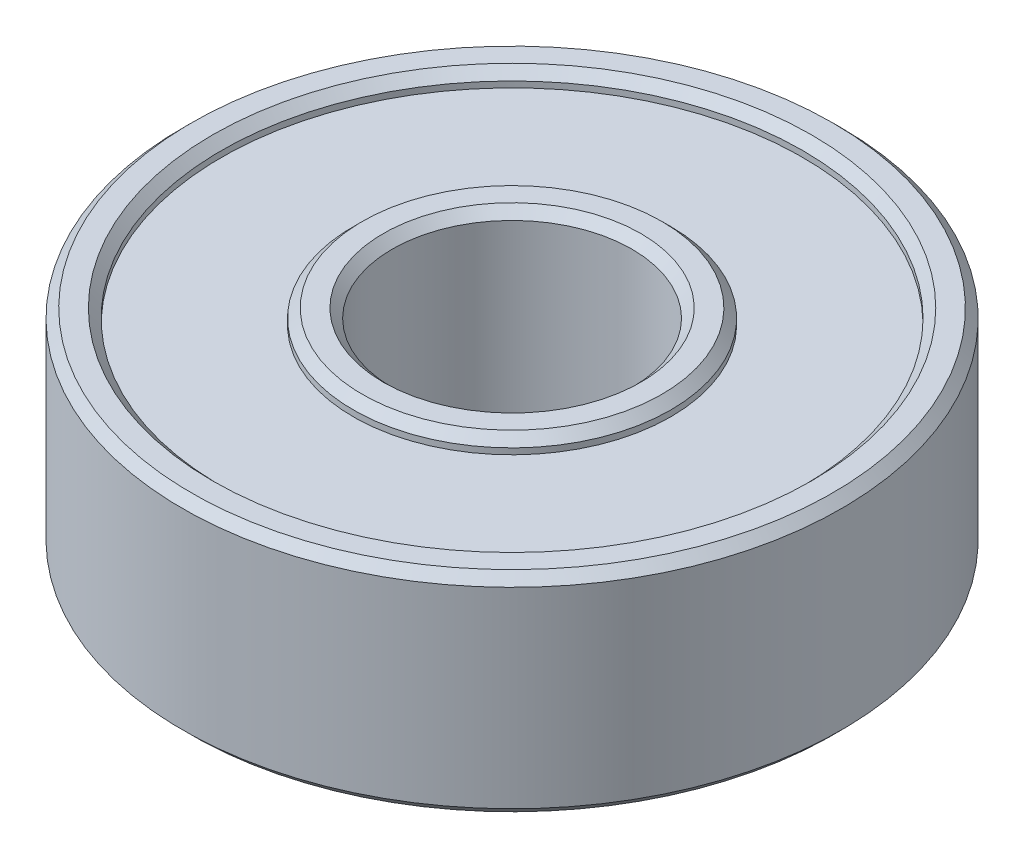
ISO-10303-21;
HEADER;
FILE_DESCRIPTION(('STEP AP214'),'2;1');
FILE_NAME('part.step','',(''),(''),'','','');
FILE_SCHEMA(('AUTOMOTIVE_DESIGN { 1 0 10303 214 1 1 1 1 }'));
ENDSEC;
DATA;
#1=APPLICATION_CONTEXT('core data for automotive mechanical design processes');
#2=APPLICATION_PROTOCOL_DEFINITION('international standard','automotive_design',2000,#1);
#3=PRODUCT_CONTEXT('',#1,'mechanical');
#4=PRODUCT('Part','Part','',(#3));
#5=PRODUCT_RELATED_PRODUCT_CATEGORY('part','',(#4));
#6=PRODUCT_DEFINITION_FORMATION('','',#4);
#7=PRODUCT_DEFINITION_CONTEXT('part definition',#1,'design');
#8=PRODUCT_DEFINITION('design','',#6,#7);
#9=PRODUCT_DEFINITION_SHAPE('','',#8);
#10=(LENGTH_UNIT() NAMED_UNIT(*) SI_UNIT(.MILLI.,.METRE.));
#11=(NAMED_UNIT(*) PLANE_ANGLE_UNIT() SI_UNIT($,.RADIAN.));
#12=(NAMED_UNIT(*) SI_UNIT($,.STERADIAN.) SOLID_ANGLE_UNIT());
#13=UNCERTAINTY_MEASURE_WITH_UNIT(LENGTH_MEASURE(1.E-05),#10,'distance_accuracy_value','');
#14=(GEOMETRIC_REPRESENTATION_CONTEXT(3) GLOBAL_UNCERTAINTY_ASSIGNED_CONTEXT((#13)) GLOBAL_UNIT_ASSIGNED_CONTEXT((#10,
#11,#12)) REPRESENTATION_CONTEXT('',''));
#15=CARTESIAN_POINT('',(0.,0.,0.));
#16=DIRECTION('',(0.,0.,1.));
#17=DIRECTION('',(1.,0.,0.));
#18=AXIS2_PLACEMENT_3D('',#15,#16,#17);
#19=CARTESIAN_POINT('',(0.,-3.5,0.));
#20=DIRECTION('',(0.,1.,0.));
#21=DIRECTION('',(0.,0.,1.));
#22=AXIS2_PLACEMENT_3D('',#19,#20,#21);
#23=CYLINDRICAL_SURFACE('',#22,9.7);
#24=CARTESIAN_POINT('',(0.,3.2,0.));
#25=DIRECTION('',(0.,-1.,0.));
#26=DIRECTION('',(0.,0.,-1.));
#27=AXIS2_PLACEMENT_3D('',#24,#25,#26);
#28=CIRCLE('',#27,9.7);
#29=CARTESIAN_POINT('',(0.,3.2,-9.7));
#30=VERTEX_POINT('',#29);
#31=EDGE_CURVE('E59',#30,#30,#28,.F.);
#32=ORIENTED_EDGE('',*,*,#31,.T.);
#33=EDGE_LOOP('',(#32));
#34=FACE_BOUND('',#33,.T.);
#35=CARTESIAN_POINT('',(0.,3.,0.));
#36=DIRECTION('',(0.,-1.,0.));
#37=DIRECTION('',(1.,0.,0.));
#38=AXIS2_PLACEMENT_3D('',#35,#36,#37);
#39=CIRCLE('',#38,9.7);
#40=CARTESIAN_POINT('',(9.7,3.,0.));
#41=VERTEX_POINT('',#40);
#42=EDGE_CURVE('E90',#41,#41,#39,.T.);
#43=ORIENTED_EDGE('',*,*,#42,.T.);
#44=EDGE_LOOP('',(#43));
#45=FACE_BOUND('',#44,.T.);
#46=ADVANCED_FACE('F14',(#34,#45),#23,.F.);
#47=CARTESIAN_POINT('',(0.,-3.2,0.));
#48=DIRECTION('',(0.,-1.,0.));
#49=DIRECTION('',(0.,0.,-1.));
#50=AXIS2_PLACEMENT_3D('',#47,#48,#49);
#51=CIRCLE('',#50,9.7);
#52=CARTESIAN_POINT('',(0.,-3.2,-9.7));
#53=VERTEX_POINT('',#52);
#54=EDGE_CURVE('E31',#53,#53,#51,.T.);
#55=ORIENTED_EDGE('',*,*,#54,.T.);
#56=EDGE_LOOP('',(#55));
#57=FACE_BOUND('',#56,.T.);
#58=CARTESIAN_POINT('',(0.,-3.,0.));
#59=DIRECTION('',(0.,-1.,0.));
#60=DIRECTION('',(1.,0.,0.));
#61=AXIS2_PLACEMENT_3D('',#58,#59,#60);
#62=CIRCLE('',#61,9.7);
#63=CARTESIAN_POINT('',(9.7,-3.,0.));
#64=VERTEX_POINT('',#63);
#65=EDGE_CURVE('E89',#64,#64,#62,.T.);
#66=ORIENTED_EDGE('',*,*,#65,.F.);
#67=EDGE_LOOP('',(#66));
#68=FACE_BOUND('',#67,.T.);
#69=ADVANCED_FACE('F117',(#57,#68),#23,.F.);
#70=CARTESIAN_POINT('',(0.,-3.5,0.));
#71=DIRECTION('',(0.,1.,0.));
#72=DIRECTION('',(0.,0.,1.));
#73=AXIS2_PLACEMENT_3D('',#70,#71,#72);
#74=CYLINDRICAL_SURFACE('',#73,11.);
#75=CARTESIAN_POINT('',(0.,3.2,0.));
#76=DIRECTION('',(0.,-1.,0.));
#77=DIRECTION('',(0.,0.,-1.));
#78=AXIS2_PLACEMENT_3D('',#75,#76,#77);
#79=CIRCLE('',#78,11.);
#80=CARTESIAN_POINT('',(0.,3.2,-11.));
#81=VERTEX_POINT('',#80);
#82=EDGE_CURVE('E52',#81,#81,#79,.T.);
#83=ORIENTED_EDGE('',*,*,#82,.T.);
#84=EDGE_LOOP('',(#83));
#85=FACE_BOUND('',#84,.T.);
#86=CARTESIAN_POINT('',(0.,-3.2,0.));
#87=DIRECTION('',(0.,-1.,0.));
#88=DIRECTION('',(0.,0.,-1.));
#89=AXIS2_PLACEMENT_3D('',#86,#87,#88);
#90=CIRCLE('',#89,11.);
#91=CARTESIAN_POINT('',(0.,-3.2,-11.));
#92=VERTEX_POINT('',#91);
#93=EDGE_CURVE('E56',#92,#92,#90,.F.);
#94=ORIENTED_EDGE('',*,*,#93,.T.);
#95=EDGE_LOOP('',(#94));
#96=FACE_BOUND('',#95,.T.);
#97=ADVANCED_FACE('F119',(#85,#96),#74,.T.);
#98=CARTESIAN_POINT('',(0.,-3.5,0.));
#99=DIRECTION('',(0.,-1.,0.));
#100=DIRECTION('',(1.,0.,0.));
#101=AXIS2_PLACEMENT_3D('',#98,#99,#100);
#102=PLANE('',#101);
#103=CARTESIAN_POINT('',(0.,-3.5,0.));
#104=DIRECTION('',(0.,-1.,0.));
#105=DIRECTION('',(0.,0.,-1.));
#106=AXIS2_PLACEMENT_3D('',#103,#104,#105);
#107=CIRCLE('',#106,10.);
#108=CARTESIAN_POINT('',(0.,-3.5,-10.));
#109=VERTEX_POINT('',#108);
#110=EDGE_CURVE('E9',#109,#109,#107,.F.);
#111=ORIENTED_EDGE('',*,*,#110,.T.);
#112=EDGE_LOOP('',(#111));
#113=FACE_BOUND('',#112,.T.);
#114=CARTESIAN_POINT('',(0.,-3.5,0.));
#115=DIRECTION('',(0.,-1.,0.));
#116=DIRECTION('',(0.,0.,-1.));
#117=AXIS2_PLACEMENT_3D('',#114,#115,#116);
#118=CIRCLE('',#117,10.7);
#119=CARTESIAN_POINT('',(0.,-3.5,-10.7));
#120=VERTEX_POINT('',#119);
#121=EDGE_CURVE('E22',#120,#120,#118,.T.);
#122=ORIENTED_EDGE('',*,*,#121,.T.);
#123=EDGE_LOOP('',(#122));
#124=FACE_BOUND('',#123,.T.);
#125=ADVANCED_FACE('F127',(#113,#124),#102,.T.);
#126=CARTESIAN_POINT('',(0.,3.5,0.));
#127=DIRECTION('',(0.,-1.,0.));
#128=DIRECTION('',(1.,0.,0.));
#129=AXIS2_PLACEMENT_3D('',#126,#127,#128);
#130=PLANE('',#129);
#131=CARTESIAN_POINT('',(0.,3.5,0.));
#132=DIRECTION('',(0.,-1.,0.));
#133=DIRECTION('',(0.,0.,-1.));
#134=AXIS2_PLACEMENT_3D('',#131,#132,#133);
#135=CIRCLE('',#134,10.);
#136=CARTESIAN_POINT('',(0.,3.5,-10.));
#137=VERTEX_POINT('',#136);
#138=EDGE_CURVE('E62',#137,#137,#135,.T.);
#139=ORIENTED_EDGE('',*,*,#138,.T.);
#140=EDGE_LOOP('',(#139));
#141=FACE_BOUND('',#140,.T.);
#142=CARTESIAN_POINT('',(0.,3.5,0.));
#143=DIRECTION('',(0.,-1.,0.));
#144=DIRECTION('',(0.,0.,-1.));
#145=AXIS2_PLACEMENT_3D('',#142,#143,#144);
#146=CIRCLE('',#145,10.7);
#147=CARTESIAN_POINT('',(0.,3.5,-10.7));
#148=VERTEX_POINT('',#147);
#149=EDGE_CURVE('E65',#148,#148,#146,.F.);
#150=ORIENTED_EDGE('',*,*,#149,.T.);
#151=EDGE_LOOP('',(#150));
#152=FACE_BOUND('',#151,.T.);
#153=ADVANCED_FACE('F132',(#141,#152),#130,.F.);
#154=CARTESIAN_POINT('',(0.,-3.5,0.));
#155=DIRECTION('',(0.,1.,0.));
#156=DIRECTION('',(0.,0.,1.));
#157=AXIS2_PLACEMENT_3D('',#154,#155,#156);
#158=CYLINDRICAL_SURFACE('',#157,5.3);
#159=CARTESIAN_POINT('',(0.,3.2,0.));
#160=DIRECTION('',(0.,-1.,0.));
#161=DIRECTION('',(0.,0.,-1.));
#162=AXIS2_PLACEMENT_3D('',#159,#160,#161);
#163=CIRCLE('',#162,5.3);
#164=CARTESIAN_POINT('',(0.,3.2,-5.3));
#165=VERTEX_POINT('',#164);
#166=EDGE_CURVE('E69',#165,#165,#163,.T.);
#167=ORIENTED_EDGE('',*,*,#166,.T.);
#168=EDGE_LOOP('',(#167));
#169=FACE_BOUND('',#168,.T.);
#170=CARTESIAN_POINT('',(0.,3.,0.));
#171=DIRECTION('',(0.,-1.,0.));
#172=DIRECTION('',(1.,0.,0.));
#173=AXIS2_PLACEMENT_3D('',#170,#171,#172);
#174=CIRCLE('',#173,5.3);
#175=CARTESIAN_POINT('',(5.3,3.,0.));
#176=VERTEX_POINT('',#175);
#177=EDGE_CURVE('E95',#176,#176,#174,.T.);
#178=ORIENTED_EDGE('',*,*,#177,.F.);
#179=EDGE_LOOP('',(#178));
#180=FACE_BOUND('',#179,.T.);
#181=ADVANCED_FACE('F203',(#169,#180),#158,.T.);
#182=CARTESIAN_POINT('',(0.,-3.5,0.));
#183=DIRECTION('',(0.,1.,0.));
#184=DIRECTION('',(0.,0.,1.));
#185=AXIS2_PLACEMENT_3D('',#182,#183,#184);
#186=CYLINDRICAL_SURFACE('',#185,4.);
#187=CARTESIAN_POINT('',(0.,3.2,0.));
#188=DIRECTION('',(0.,-1.,0.));
#189=DIRECTION('',(0.,0.,-1.));
#190=AXIS2_PLACEMENT_3D('',#187,#188,#189);
#191=CIRCLE('',#190,4.);
#192=CARTESIAN_POINT('',(0.,3.2,-4.));
#193=VERTEX_POINT('',#192);
#194=EDGE_CURVE('E73',#193,#193,#191,.F.);
#195=ORIENTED_EDGE('',*,*,#194,.T.);
#196=EDGE_LOOP('',(#195));
#197=FACE_BOUND('',#196,.T.);
#198=CARTESIAN_POINT('',(0.,-3.2,0.));
#199=DIRECTION('',(0.,-1.,0.));
#200=DIRECTION('',(0.,0.,-1.));
#201=AXIS2_PLACEMENT_3D('',#198,#199,#200);
#202=CIRCLE('',#201,4.);
#203=CARTESIAN_POINT('',(0.,-3.2,-4.));
#204=VERTEX_POINT('',#203);
#205=EDGE_CURVE('E77',#204,#204,#202,.T.);
#206=ORIENTED_EDGE('',*,*,#205,.T.);
#207=EDGE_LOOP('',(#206));
#208=FACE_BOUND('',#207,.T.);
#209=ADVANCED_FACE('F224',(#197,#208),#186,.F.);
#210=CARTESIAN_POINT('',(0.,-3.2,0.));
#211=DIRECTION('',(0.,-1.,0.));
#212=DIRECTION('',(0.,0.,-1.));
#213=AXIS2_PLACEMENT_3D('',#210,#211,#212);
#214=CIRCLE('',#213,5.3);
#215=CARTESIAN_POINT('',(0.,-3.2,-5.3));
#216=VERTEX_POINT('',#215);
#217=EDGE_CURVE('E38',#216,#216,#214,.F.);
#218=ORIENTED_EDGE('',*,*,#217,.T.);
#219=EDGE_LOOP('',(#218));
#220=FACE_BOUND('',#219,.T.);
#221=CARTESIAN_POINT('',(0.,-3.,0.));
#222=DIRECTION('',(0.,-1.,0.));
#223=DIRECTION('',(1.,0.,0.));
#224=AXIS2_PLACEMENT_3D('',#221,#222,#223);
#225=CIRCLE('',#224,5.3);
#226=CARTESIAN_POINT('',(5.3,-3.,0.));
#227=VERTEX_POINT('',#226);
#228=EDGE_CURVE('E94',#227,#227,#225,.T.);
#229=ORIENTED_EDGE('',*,*,#228,.T.);
#230=EDGE_LOOP('',(#229));
#231=FACE_BOUND('',#230,.T.);
#232=ADVANCED_FACE('F107',(#220,#231),#158,.T.);
#233=CARTESIAN_POINT('',(0.,-3.5,0.));
#234=DIRECTION('',(0.,-1.,0.));
#235=DIRECTION('',(1.,0.,0.));
#236=AXIS2_PLACEMENT_3D('',#233,#234,#235);
#237=PLANE('',#236);
#238=CARTESIAN_POINT('',(0.,-3.5,0.));
#239=DIRECTION('',(0.,-1.,0.));
#240=DIRECTION('',(0.,0.,-1.));
#241=AXIS2_PLACEMENT_3D('',#238,#239,#240);
#242=CIRCLE('',#241,4.3);
#243=CARTESIAN_POINT('',(0.,-3.5,-4.3));
#244=VERTEX_POINT('',#243);
#245=EDGE_CURVE('E44',#244,#244,#242,.F.);
#246=ORIENTED_EDGE('',*,*,#245,.T.);
#247=EDGE_LOOP('',(#246));
#248=FACE_BOUND('',#247,.T.);
#249=CARTESIAN_POINT('',(0.,-3.5,0.));
#250=DIRECTION('',(0.,-1.,0.));
#251=DIRECTION('',(0.,0.,-1.));
#252=AXIS2_PLACEMENT_3D('',#249,#250,#251);
#253=CIRCLE('',#252,5.);
#254=CARTESIAN_POINT('',(0.,-3.5,-5.));
#255=VERTEX_POINT('',#254);
#256=EDGE_CURVE('E48',#255,#255,#253,.T.);
#257=ORIENTED_EDGE('',*,*,#256,.T.);
#258=EDGE_LOOP('',(#257));
#259=FACE_BOUND('',#258,.T.);
#260=ADVANCED_FACE('F213',(#248,#259),#237,.T.);
#261=CARTESIAN_POINT('',(0.,3.5,0.));
#262=DIRECTION('',(0.,-1.,0.));
#263=DIRECTION('',(1.,0.,0.));
#264=AXIS2_PLACEMENT_3D('',#261,#262,#263);
#265=PLANE('',#264);
#266=CARTESIAN_POINT('',(0.,3.5,0.));
#267=DIRECTION('',(0.,-1.,0.));
#268=DIRECTION('',(0.,0.,-1.));
#269=AXIS2_PLACEMENT_3D('',#266,#267,#268);
#270=CIRCLE('',#269,4.3);
#271=CARTESIAN_POINT('',(0.,3.5,-4.3));
#272=VERTEX_POINT('',#271);
#273=EDGE_CURVE('E81',#272,#272,#270,.T.);
#274=ORIENTED_EDGE('',*,*,#273,.T.);
#275=EDGE_LOOP('',(#274));
#276=FACE_BOUND('',#275,.T.);
#277=CARTESIAN_POINT('',(0.,3.5,0.));
#278=DIRECTION('',(0.,-1.,0.));
#279=DIRECTION('',(0.,0.,-1.));
#280=AXIS2_PLACEMENT_3D('',#277,#278,#279);
#281=CIRCLE('',#280,5.);
#282=CARTESIAN_POINT('',(0.,3.5,-5.));
#283=VERTEX_POINT('',#282);
#284=EDGE_CURVE('E85',#283,#283,#281,.F.);
#285=ORIENTED_EDGE('',*,*,#284,.T.);
#286=EDGE_LOOP('',(#285));
#287=FACE_BOUND('',#286,.T.);
#288=ADVANCED_FACE('F113',(#276,#287),#265,.F.);
#289=CARTESIAN_POINT('',(0.,-3.,0.));
#290=DIRECTION('',(0.,-1.,0.));
#291=DIRECTION('',(1.,0.,0.));
#292=AXIS2_PLACEMENT_3D('',#289,#290,#291);
#293=PLANE('',#292);
#294=ORIENTED_EDGE('',*,*,#228,.F.);
#295=EDGE_LOOP('',(#294));
#296=FACE_BOUND('',#295,.T.);
#297=ORIENTED_EDGE('',*,*,#65,.T.);
#298=EDGE_LOOP('',(#297));
#299=FACE_BOUND('',#298,.T.);
#300=ADVANCED_FACE('F109',(#296,#299),#293,.T.);
#301=CARTESIAN_POINT('',(0.,3.,0.));
#302=DIRECTION('',(0.,-1.,0.));
#303=DIRECTION('',(1.,0.,0.));
#304=AXIS2_PLACEMENT_3D('',#301,#302,#303);
#305=PLANE('',#304);
#306=ORIENTED_EDGE('',*,*,#177,.T.);
#307=EDGE_LOOP('',(#306));
#308=FACE_BOUND('',#307,.T.);
#309=ORIENTED_EDGE('',*,*,#42,.F.);
#310=EDGE_LOOP('',(#309));
#311=FACE_BOUND('',#310,.T.);
#312=ADVANCED_FACE('F112',(#308,#311),#305,.F.);
#313=CARTESIAN_POINT('',(0.,3.5,0.));
#314=DIRECTION('',(0.,1.,0.));
#315=DIRECTION('',(0.,0.,1.));
#316=AXIS2_PLACEMENT_3D('',#313,#314,#315);
#317=CONICAL_SURFACE('',#316,4.3,0.785398163397448);
#318=ORIENTED_EDGE('',*,*,#194,.F.);
#319=EDGE_LOOP('',(#318));
#320=FACE_BOUND('',#319,.T.);
#321=ORIENTED_EDGE('',*,*,#273,.F.);
#322=EDGE_LOOP('',(#321));
#323=FACE_BOUND('',#322,.T.);
#324=ADVANCED_FACE('F135',(#320,#323),#317,.F.);
#325=CARTESIAN_POINT('',(0.,3.2,0.));
#326=DIRECTION('',(0.,-1.,0.));
#327=DIRECTION('',(0.,0.,-1.));
#328=AXIS2_PLACEMENT_3D('',#325,#326,#327);
#329=CONICAL_SURFACE('',#328,5.3,0.785398163397448);
#330=ORIENTED_EDGE('',*,*,#284,.F.);
#331=EDGE_LOOP('',(#330));
#332=FACE_BOUND('',#331,.T.);
#333=ORIENTED_EDGE('',*,*,#166,.F.);
#334=EDGE_LOOP('',(#333));
#335=FACE_BOUND('',#334,.T.);
#336=ADVANCED_FACE('F138',(#332,#335),#329,.T.);
#337=CARTESIAN_POINT('',(0.,3.5,0.));
#338=DIRECTION('',(0.,1.,0.));
#339=DIRECTION('',(0.,0.,1.));
#340=AXIS2_PLACEMENT_3D('',#337,#338,#339);
#341=CONICAL_SURFACE('',#340,10.,0.785398163397448);
#342=ORIENTED_EDGE('',*,*,#31,.F.);
#343=EDGE_LOOP('',(#342));
#344=FACE_BOUND('',#343,.T.);
#345=ORIENTED_EDGE('',*,*,#138,.F.);
#346=EDGE_LOOP('',(#345));
#347=FACE_BOUND('',#346,.T.);
#348=ADVANCED_FACE('F142',(#344,#347),#341,.F.);
#349=CARTESIAN_POINT('',(0.,3.2,0.));
#350=DIRECTION('',(0.,-1.,0.));
#351=DIRECTION('',(0.,0.,-1.));
#352=AXIS2_PLACEMENT_3D('',#349,#350,#351);
#353=CONICAL_SURFACE('',#352,11.,0.785398163397448);
#354=ORIENTED_EDGE('',*,*,#149,.F.);
#355=EDGE_LOOP('',(#354));
#356=FACE_BOUND('',#355,.T.);
#357=ORIENTED_EDGE('',*,*,#82,.F.);
#358=EDGE_LOOP('',(#357));
#359=FACE_BOUND('',#358,.T.);
#360=ADVANCED_FACE('F146',(#356,#359),#353,.T.);
#361=CARTESIAN_POINT('',(0.,-3.2,0.));
#362=DIRECTION('',(0.,-1.,0.));
#363=DIRECTION('',(0.,0.,-1.));
#364=AXIS2_PLACEMENT_3D('',#361,#362,#363);
#365=CONICAL_SURFACE('',#364,4.,0.785398163397448);
#366=ORIENTED_EDGE('',*,*,#245,.F.);
#367=EDGE_LOOP('',(#366));
#368=FACE_BOUND('',#367,.T.);
#369=ORIENTED_EDGE('',*,*,#205,.F.);
#370=EDGE_LOOP('',(#369));
#371=FACE_BOUND('',#370,.T.);
#372=ADVANCED_FACE('F150',(#368,#371),#365,.F.);
#373=CARTESIAN_POINT('',(0.,-3.5,0.));
#374=DIRECTION('',(0.,1.,0.));
#375=DIRECTION('',(0.,0.,1.));
#376=AXIS2_PLACEMENT_3D('',#373,#374,#375);
#377=CONICAL_SURFACE('',#376,5.,0.785398163397448);
#378=ORIENTED_EDGE('',*,*,#217,.F.);
#379=EDGE_LOOP('',(#378));
#380=FACE_BOUND('',#379,.T.);
#381=ORIENTED_EDGE('',*,*,#256,.F.);
#382=EDGE_LOOP('',(#381));
#383=FACE_BOUND('',#382,.T.);
#384=ADVANCED_FACE('F154',(#380,#383),#377,.T.);
#385=CARTESIAN_POINT('',(0.,-3.2,0.));
#386=DIRECTION('',(0.,-1.,0.));
#387=DIRECTION('',(0.,0.,-1.));
#388=AXIS2_PLACEMENT_3D('',#385,#386,#387);
#389=CONICAL_SURFACE('',#388,9.7,0.785398163397448);
#390=ORIENTED_EDGE('',*,*,#110,.F.);
#391=EDGE_LOOP('',(#390));
#392=FACE_BOUND('',#391,.T.);
#393=ORIENTED_EDGE('',*,*,#54,.F.);
#394=EDGE_LOOP('',(#393));
#395=FACE_BOUND('',#394,.T.);
#396=ADVANCED_FACE('F157',(#392,#395),#389,.F.);
#397=CARTESIAN_POINT('',(0.,-3.5,0.));
#398=DIRECTION('',(0.,1.,0.));
#399=DIRECTION('',(0.,0.,1.));
#400=AXIS2_PLACEMENT_3D('',#397,#398,#399);
#401=CONICAL_SURFACE('',#400,10.7,0.785398163397448);
#402=ORIENTED_EDGE('',*,*,#93,.F.);
#403=EDGE_LOOP('',(#402));
#404=FACE_BOUND('',#403,.T.);
#405=ORIENTED_EDGE('',*,*,#121,.F.);
#406=EDGE_LOOP('',(#405));
#407=FACE_BOUND('',#406,.T.);
#408=ADVANCED_FACE('F16',(#404,#407),#401,.T.);
#409=CLOSED_SHELL('',(#46,#69,#97,#125,#153,#181,#209,#232,#260,#288,#300,#312,#324,#336,#348,
#360,#372,#384,#396,#408));
#410=MANIFOLD_SOLID_BREP('B1',#409);
#411=ADVANCED_BREP_SHAPE_REPRESENTATION('',(#18,#410),#14);
#412=SHAPE_DEFINITION_REPRESENTATION(#9,#411);
ENDSEC;
END-ISO-10303-21;
